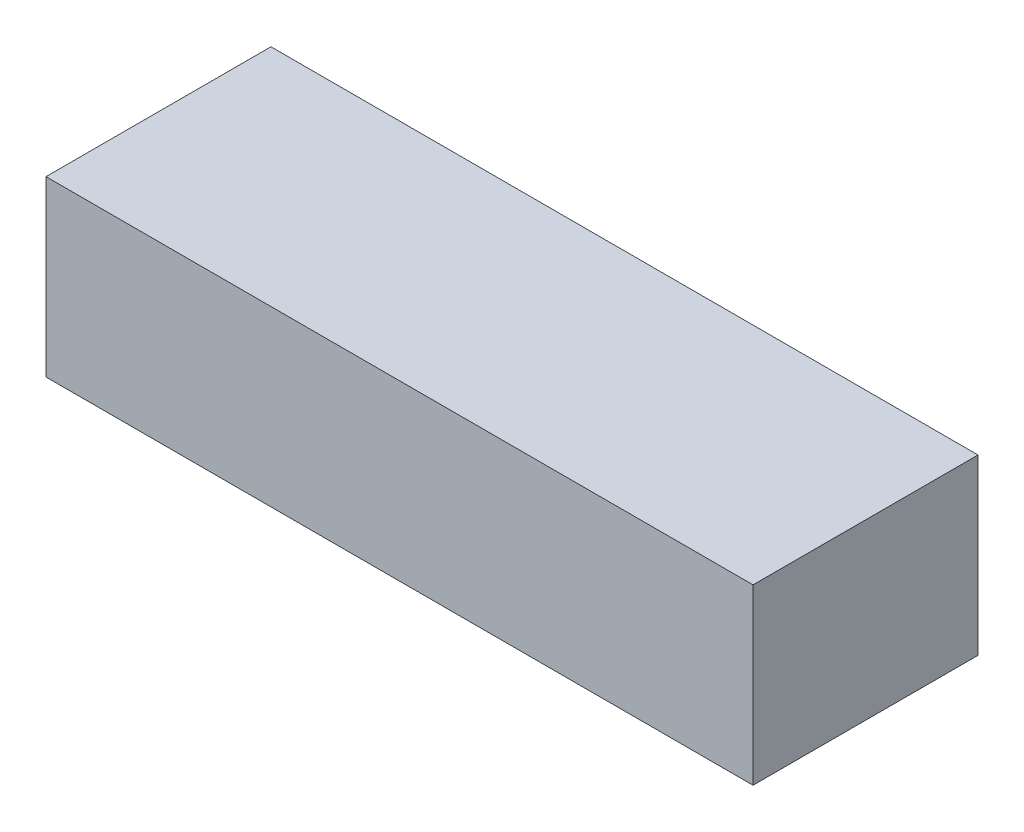
ISO-10303-21;
HEADER;
FILE_DESCRIPTION(('STEP AP214'),'2;1');
FILE_NAME('part.step','',(''),(''),'','','');
FILE_SCHEMA(('AUTOMOTIVE_DESIGN { 1 0 10303 214 1 1 1 1 }'));
ENDSEC;
DATA;
#1=APPLICATION_CONTEXT('core data for automotive mechanical design processes');
#2=APPLICATION_PROTOCOL_DEFINITION('international standard','automotive_design',2000,#1);
#3=PRODUCT_CONTEXT('',#1,'mechanical');
#4=PRODUCT('Part','Part','',(#3));
#5=PRODUCT_RELATED_PRODUCT_CATEGORY('part','',(#4));
#6=PRODUCT_DEFINITION_FORMATION('','',#4);
#7=PRODUCT_DEFINITION_CONTEXT('part definition',#1,'design');
#8=PRODUCT_DEFINITION('design','',#6,#7);
#9=PRODUCT_DEFINITION_SHAPE('','',#8);
#10=(LENGTH_UNIT() NAMED_UNIT(*) SI_UNIT(.MILLI.,.METRE.));
#11=(NAMED_UNIT(*) PLANE_ANGLE_UNIT() SI_UNIT($,.RADIAN.));
#12=(NAMED_UNIT(*) SI_UNIT($,.STERADIAN.) SOLID_ANGLE_UNIT());
#13=UNCERTAINTY_MEASURE_WITH_UNIT(LENGTH_MEASURE(1.E-05),#10,'distance_accuracy_value','');
#14=(GEOMETRIC_REPRESENTATION_CONTEXT(3) GLOBAL_UNCERTAINTY_ASSIGNED_CONTEXT((#13)) GLOBAL_UNIT_ASSIGNED_CONTEXT((#10,
#11,#12)) REPRESENTATION_CONTEXT('',''));
#15=CARTESIAN_POINT('',(0.,0.,0.));
#16=DIRECTION('',(0.,0.,1.));
#17=DIRECTION('',(1.,0.,0.));
#18=AXIS2_PLACEMENT_3D('',#15,#16,#17);
#19=CARTESIAN_POINT('',(55.,27.,-17.5));
#20=DIRECTION('',(-1.,0.,0.));
#21=DIRECTION('',(0.,0.,1.));
#22=AXIS2_PLACEMENT_3D('',#19,#20,#21);
#23=PLANE('',#22);
#24=DIRECTION('',(0.,0.,-1.));
#25=VECTOR('',#24,1.);
#26=CARTESIAN_POINT('',(55.,0.,-17.5));
#27=LINE('',#26,#25);
#28=CARTESIAN_POINT('',(55.,0.,17.5));
#29=VERTEX_POINT('',#28);
#30=CARTESIAN_POINT('',(55.,0.,-17.5));
#31=VERTEX_POINT('',#30);
#32=EDGE_CURVE('E100',#29,#31,#27,.T.);
#33=ORIENTED_EDGE('',*,*,#32,.T.);
#34=DIRECTION('',(0.,-1.,0.));
#35=VECTOR('',#34,1.);
#36=CARTESIAN_POINT('',(55.,27.,-17.5));
#37=LINE('',#36,#35);
#38=CARTESIAN_POINT('',(55.,27.,-17.5));
#39=VERTEX_POINT('',#38);
#40=EDGE_CURVE('E11',#39,#31,#37,.T.);
#41=ORIENTED_EDGE('',*,*,#40,.F.);
#42=DIRECTION('',(0.,0.,-1.));
#43=VECTOR('',#42,1.);
#44=CARTESIAN_POINT('',(55.,27.,-17.5));
#45=LINE('',#44,#43);
#46=CARTESIAN_POINT('',(55.,27.,17.5));
#47=VERTEX_POINT('',#46);
#48=EDGE_CURVE('E88',#47,#39,#45,.T.);
#49=ORIENTED_EDGE('',*,*,#48,.F.);
#50=DIRECTION('',(0.,-1.,0.));
#51=VECTOR('',#50,1.);
#52=CARTESIAN_POINT('',(55.,27.,17.5));
#53=LINE('',#52,#51);
#54=EDGE_CURVE('E96',#47,#29,#53,.T.);
#55=ORIENTED_EDGE('',*,*,#54,.T.);
#56=EDGE_LOOP('',(#33,#41,#49,#55));
#57=FACE_BOUND('',#56,.T.);
#58=ADVANCED_FACE('F37',(#57),#23,.F.);
#59=CARTESIAN_POINT('',(-55.,27.,-17.5));
#60=DIRECTION('',(0.,0.,1.));
#61=DIRECTION('',(1.,0.,0.));
#62=AXIS2_PLACEMENT_3D('',#59,#60,#61);
#63=PLANE('',#62);
#64=DIRECTION('',(-1.,0.,0.));
#65=VECTOR('',#64,1.);
#66=CARTESIAN_POINT('',(-55.,0.,-17.5));
#67=LINE('',#66,#65);
#68=CARTESIAN_POINT('',(-55.,0.,-17.5));
#69=VERTEX_POINT('',#68);
#70=EDGE_CURVE('E92',#31,#69,#67,.T.);
#71=ORIENTED_EDGE('',*,*,#70,.T.);
#72=DIRECTION('',(0.,-1.,0.));
#73=VECTOR('',#72,1.);
#74=CARTESIAN_POINT('',(-55.,27.,-17.5));
#75=LINE('',#74,#73);
#76=CARTESIAN_POINT('',(-55.,27.,-17.5));
#77=VERTEX_POINT('',#76);
#78=EDGE_CURVE('E45',#77,#69,#75,.T.);
#79=ORIENTED_EDGE('',*,*,#78,.F.);
#80=DIRECTION('',(-1.,0.,0.));
#81=VECTOR('',#80,1.);
#82=CARTESIAN_POINT('',(-55.,27.,-17.5));
#83=LINE('',#82,#81);
#84=EDGE_CURVE('E83',#39,#77,#83,.T.);
#85=ORIENTED_EDGE('',*,*,#84,.F.);
#86=ORIENTED_EDGE('',*,*,#40,.T.);
#87=EDGE_LOOP('',(#71,#79,#85,#86));
#88=FACE_BOUND('',#87,.T.);
#89=ADVANCED_FACE('F91',(#88),#63,.F.);
#90=CARTESIAN_POINT('',(-55.,27.,-17.5));
#91=DIRECTION('',(1.,0.,0.));
#92=DIRECTION('',(0.,0.,-1.));
#93=AXIS2_PLACEMENT_3D('',#90,#91,#92);
#94=PLANE('',#93);
#95=DIRECTION('',(0.,0.,1.));
#96=VECTOR('',#95,1.);
#97=CARTESIAN_POINT('',(-55.,0.,-17.5));
#98=LINE('',#97,#96);
#99=CARTESIAN_POINT('',(-55.,0.,17.5));
#100=VERTEX_POINT('',#99);
#101=EDGE_CURVE('E70',#69,#100,#98,.T.);
#102=ORIENTED_EDGE('',*,*,#101,.T.);
#103=DIRECTION('',(0.,-1.,0.));
#104=VECTOR('',#103,1.);
#105=CARTESIAN_POINT('',(-55.,27.,17.5));
#106=LINE('',#105,#104);
#107=CARTESIAN_POINT('',(-55.,27.,17.5));
#108=VERTEX_POINT('',#107);
#109=EDGE_CURVE('E93',#108,#100,#106,.T.);
#110=ORIENTED_EDGE('',*,*,#109,.F.);
#111=DIRECTION('',(0.,0.,1.));
#112=VECTOR('',#111,1.);
#113=CARTESIAN_POINT('',(-55.,27.,-17.5));
#114=LINE('',#113,#112);
#115=EDGE_CURVE('E86',#77,#108,#114,.T.);
#116=ORIENTED_EDGE('',*,*,#115,.F.);
#117=ORIENTED_EDGE('',*,*,#78,.T.);
#118=EDGE_LOOP('',(#102,#110,#116,#117));
#119=FACE_BOUND('',#118,.T.);
#120=ADVANCED_FACE('F94',(#119),#94,.F.);
#121=CARTESIAN_POINT('',(-55.,27.,17.5));
#122=DIRECTION('',(0.,0.,-1.));
#123=DIRECTION('',(-1.,0.,0.));
#124=AXIS2_PLACEMENT_3D('',#121,#122,#123);
#125=PLANE('',#124);
#126=DIRECTION('',(1.,0.,0.));
#127=VECTOR('',#126,1.);
#128=CARTESIAN_POINT('',(-55.,0.,17.5));
#129=LINE('',#128,#127);
#130=EDGE_CURVE('E76',#100,#29,#129,.T.);
#131=ORIENTED_EDGE('',*,*,#130,.T.);
#132=ORIENTED_EDGE('',*,*,#54,.F.);
#133=DIRECTION('',(1.,0.,0.));
#134=VECTOR('',#133,1.);
#135=CARTESIAN_POINT('',(-55.,27.,17.5));
#136=LINE('',#135,#134);
#137=EDGE_CURVE('E53',#108,#47,#136,.T.);
#138=ORIENTED_EDGE('',*,*,#137,.F.);
#139=ORIENTED_EDGE('',*,*,#109,.T.);
#140=EDGE_LOOP('',(#131,#132,#138,#139));
#141=FACE_BOUND('',#140,.T.);
#142=ADVANCED_FACE('F107',(#141),#125,.F.);
#143=CARTESIAN_POINT('',(0.,27.,0.));
#144=DIRECTION('',(0.,1.,0.));
#145=DIRECTION('',(0.,0.,1.));
#146=AXIS2_PLACEMENT_3D('',#143,#144,#145);
#147=PLANE('',#146);
#148=ORIENTED_EDGE('',*,*,#48,.T.);
#149=ORIENTED_EDGE('',*,*,#84,.T.);
#150=ORIENTED_EDGE('',*,*,#115,.T.);
#151=ORIENTED_EDGE('',*,*,#137,.T.);
#152=EDGE_LOOP('',(#148,#149,#150,#151));
#153=FACE_BOUND('',#152,.T.);
#154=ADVANCED_FACE('F84',(#153),#147,.T.);
#155=CARTESIAN_POINT('',(0.,0.,0.));
#156=DIRECTION('',(0.,1.,0.));
#157=DIRECTION('',(0.,0.,1.));
#158=AXIS2_PLACEMENT_3D('',#155,#156,#157);
#159=PLANE('',#158);
#160=ORIENTED_EDGE('',*,*,#32,.F.);
#161=ORIENTED_EDGE('',*,*,#130,.F.);
#162=ORIENTED_EDGE('',*,*,#101,.F.);
#163=ORIENTED_EDGE('',*,*,#70,.F.);
#164=EDGE_LOOP('',(#160,#161,#162,#163));
#165=FACE_BOUND('',#164,.T.);
#166=ADVANCED_FACE('F110',(#165),#159,.F.);
#167=CLOSED_SHELL('',(#58,#89,#120,#142,#154,#166));
#168=MANIFOLD_SOLID_BREP('B2',#167);
#169=ADVANCED_BREP_SHAPE_REPRESENTATION('',(#18,#168),#14);
#170=SHAPE_DEFINITION_REPRESENTATION(#9,#169);
ENDSEC;
END-ISO-10303-21;
